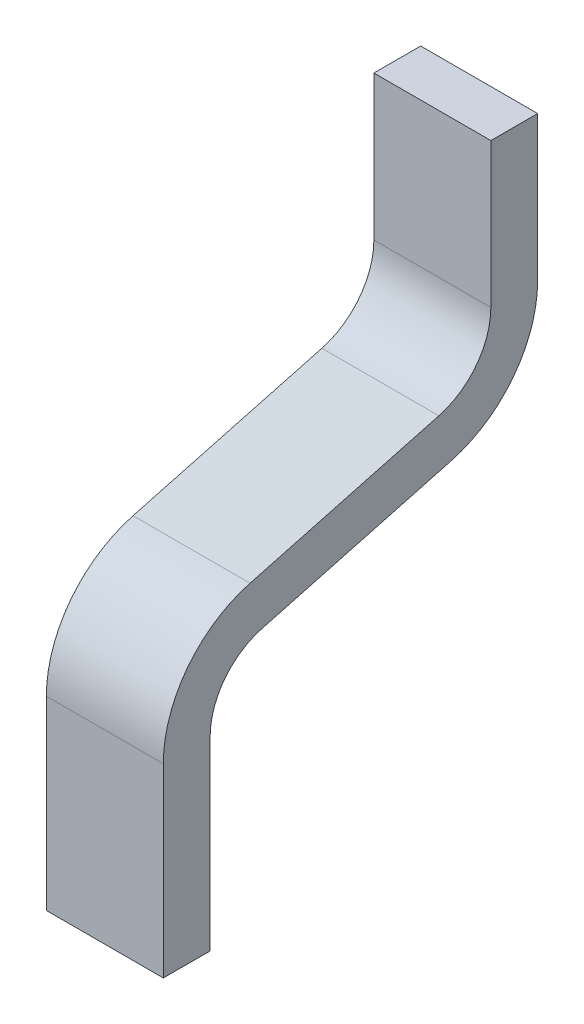
ISO-10303-21;
HEADER;
FILE_DESCRIPTION(('STEP AP214'),'2;1');
FILE_NAME('part.step','',(''),(''),'','','');
FILE_SCHEMA(('AUTOMOTIVE_DESIGN { 1 0 10303 214 1 1 1 1 }'));
ENDSEC;
DATA;
#1=APPLICATION_CONTEXT('core data for automotive mechanical design processes');
#2=APPLICATION_PROTOCOL_DEFINITION('international standard','automotive_design',2000,#1);
#3=PRODUCT_CONTEXT('',#1,'mechanical');
#4=PRODUCT('Part','Part','',(#3));
#5=PRODUCT_RELATED_PRODUCT_CATEGORY('part','',(#4));
#6=PRODUCT_DEFINITION_FORMATION('','',#4);
#7=PRODUCT_DEFINITION_CONTEXT('part definition',#1,'design');
#8=PRODUCT_DEFINITION('design','',#6,#7);
#9=PRODUCT_DEFINITION_SHAPE('','',#8);
#10=(LENGTH_UNIT() NAMED_UNIT(*) SI_UNIT(.MILLI.,.METRE.));
#11=(NAMED_UNIT(*) PLANE_ANGLE_UNIT() SI_UNIT($,.RADIAN.));
#12=(NAMED_UNIT(*) SI_UNIT($,.STERADIAN.) SOLID_ANGLE_UNIT());
#13=UNCERTAINTY_MEASURE_WITH_UNIT(LENGTH_MEASURE(1.E-05),#10,'distance_accuracy_value','');
#14=(GEOMETRIC_REPRESENTATION_CONTEXT(3) GLOBAL_UNCERTAINTY_ASSIGNED_CONTEXT((#13)) GLOBAL_UNIT_ASSIGNED_CONTEXT((#10,
#11,#12)) REPRESENTATION_CONTEXT('',''));
#15=CARTESIAN_POINT('',(0.,0.,0.));
#16=DIRECTION('',(0.,0.,1.));
#17=DIRECTION('',(1.,0.,0.));
#18=AXIS2_PLACEMENT_3D('',#15,#16,#17);
#19=CARTESIAN_POINT('',(-0.125,0.396534602404,-0.05));
#20=DIRECTION('',(0.,0.,1.));
#21=DIRECTION('',(1.,0.,0.));
#22=AXIS2_PLACEMENT_3D('',#19,#20,#21);
#23=PLANE('',#22);
#24=DIRECTION('',(0.,1.,0.));
#25=VECTOR('',#24,1.);
#26=CARTESIAN_POINT('',(-0.125,0.396534602404,-0.05));
#27=LINE('',#26,#25);
#28=CARTESIAN_POINT('',(-0.125,0.,-0.05));
#29=VERTEX_POINT('',#28);
#30=CARTESIAN_POINT('',(-0.125,0.396534602404,-0.05));
#31=VERTEX_POINT('',#30);
#32=EDGE_CURVE('E187',#29,#31,#27,.T.);
#33=ORIENTED_EDGE('',*,*,#32,.T.);
#34=DIRECTION('',(-1.,0.,0.));
#35=VECTOR('',#34,1.);
#36=CARTESIAN_POINT('',(0.,0.396534602404,-0.05));
#37=LINE('',#36,#35);
#38=CARTESIAN_POINT('',(0.125,0.396534602404,-0.05));
#39=VERTEX_POINT('',#38);
#40=EDGE_CURVE('E81',#31,#39,#37,.F.);
#41=ORIENTED_EDGE('',*,*,#40,.T.);
#42=DIRECTION('',(0.,1.,0.));
#43=VECTOR('',#42,1.);
#44=CARTESIAN_POINT('',(0.125,0.396534602404,-0.05));
#45=LINE('',#44,#43);
#46=CARTESIAN_POINT('',(0.125,0.,-0.05));
#47=VERTEX_POINT('',#46);
#48=EDGE_CURVE('E206',#39,#47,#45,.F.);
#49=ORIENTED_EDGE('',*,*,#48,.T.);
#50=DIRECTION('',(1.,0.,0.));
#51=VECTOR('',#50,1.);
#52=CARTESIAN_POINT('',(0.,0.,-0.05));
#53=LINE('',#52,#51);
#54=EDGE_CURVE('E208',#47,#29,#53,.F.);
#55=ORIENTED_EDGE('',*,*,#54,.T.);
#56=EDGE_LOOP('',(#33,#41,#49,#55));
#57=FACE_BOUND('',#56,.T.);
#58=ADVANCED_FACE('F17',(#57),#23,.F.);
#59=CARTESIAN_POINT('',(-0.125,0.891029832298,-0.75));
#60=DIRECTION('',(0.,0.,-1.));
#61=DIRECTION('',(-1.,0.,0.));
#62=AXIS2_PLACEMENT_3D('',#59,#60,#61);
#63=PLANE('',#62);
#64=DIRECTION('',(1.,0.,0.));
#65=VECTOR('',#64,1.);
#66=CARTESIAN_POINT('',(0.,1.2,-0.75));
#67=LINE('',#66,#65);
#68=CARTESIAN_POINT('',(0.125,1.2,-0.75));
#69=VERTEX_POINT('',#68);
#70=CARTESIAN_POINT('',(-0.125,1.2,-0.75));
#71=VERTEX_POINT('',#70);
#72=EDGE_CURVE('E194',#69,#71,#67,.F.);
#73=ORIENTED_EDGE('',*,*,#72,.F.);
#74=DIRECTION('',(0.,1.,0.));
#75=VECTOR('',#74,1.);
#76=CARTESIAN_POINT('',(0.125,0.891029832298,-0.75));
#77=LINE('',#76,#75);
#78=CARTESIAN_POINT('',(0.125,0.891029832298,-0.75));
#79=VERTEX_POINT('',#78);
#80=EDGE_CURVE('E192',#79,#69,#77,.T.);
#81=ORIENTED_EDGE('',*,*,#80,.F.);
#82=DIRECTION('',(1.,0.,0.));
#83=VECTOR('',#82,1.);
#84=CARTESIAN_POINT('',(0.,0.891029832298,-0.75));
#85=LINE('',#84,#83);
#86=CARTESIAN_POINT('',(-0.125,0.891029832298,-0.75));
#87=VERTEX_POINT('',#86);
#88=EDGE_CURVE('E171',#87,#79,#85,.T.);
#89=ORIENTED_EDGE('',*,*,#88,.F.);
#90=DIRECTION('',(0.,1.,0.));
#91=VECTOR('',#90,1.);
#92=CARTESIAN_POINT('',(-0.125,0.891029832298,-0.75));
#93=LINE('',#92,#91);
#94=EDGE_CURVE('E180',#71,#87,#93,.F.);
#95=ORIENTED_EDGE('',*,*,#94,.F.);
#96=EDGE_LOOP('',(#73,#81,#89,#95));
#97=FACE_BOUND('',#96,.T.);
#98=ADVANCED_FACE('F360',(#97),#63,.T.);
#99=CARTESIAN_POINT('',(0.,0.,0.));
#100=DIRECTION('',(0.,1.,0.));
#101=DIRECTION('',(0.,0.,1.));
#102=AXIS2_PLACEMENT_3D('',#99,#100,#101);
#103=PLANE('',#102);
#104=DIRECTION('',(-1.,0.,0.));
#105=VECTOR('',#104,1.);
#106=CARTESIAN_POINT('',(-0.125,0.,0.05));
#107=LINE('',#106,#105);
#108=CARTESIAN_POINT('',(0.125,0.,0.05));
#109=VERTEX_POINT('',#108);
#110=CARTESIAN_POINT('',(-0.125,0.,0.05));
#111=VERTEX_POINT('',#110);
#112=EDGE_CURVE('E175',#109,#111,#107,.T.);
#113=ORIENTED_EDGE('',*,*,#112,.T.);
#114=DIRECTION('',(0.,0.,-1.));
#115=VECTOR('',#114,1.);
#116=CARTESIAN_POINT('',(-0.125,0.,-0.05));
#117=LINE('',#116,#115);
#118=EDGE_CURVE('E189',#111,#29,#117,.T.);
#119=ORIENTED_EDGE('',*,*,#118,.T.);
#120=ORIENTED_EDGE('',*,*,#54,.F.);
#121=DIRECTION('',(0.,0.,1.));
#122=VECTOR('',#121,1.);
#123=CARTESIAN_POINT('',(0.125,0.,-0.05));
#124=LINE('',#123,#122);
#125=EDGE_CURVE('E92',#47,#109,#124,.T.);
#126=ORIENTED_EDGE('',*,*,#125,.T.);
#127=EDGE_LOOP('',(#113,#119,#120,#126));
#128=FACE_BOUND('',#127,.T.);
#129=ADVANCED_FACE('F225',(#128),#103,.F.);
#130=CARTESIAN_POINT('',(0.,1.2,-0.7));
#131=DIRECTION('',(0.,1.,0.));
#132=DIRECTION('',(0.,0.,1.));
#133=AXIS2_PLACEMENT_3D('',#130,#131,#132);
#134=PLANE('',#133);
#135=DIRECTION('',(0.,0.,1.));
#136=VECTOR('',#135,1.);
#137=CARTESIAN_POINT('',(-0.125,1.2,-0.75));
#138=LINE('',#137,#136);
#139=CARTESIAN_POINT('',(-0.125,1.2,-0.65));
#140=VERTEX_POINT('',#139);
#141=EDGE_CURVE('E183',#140,#71,#138,.F.);
#142=ORIENTED_EDGE('',*,*,#141,.F.);
#143=DIRECTION('',(1.,0.,0.));
#144=VECTOR('',#143,1.);
#145=CARTESIAN_POINT('',(-0.125,1.2,-0.65));
#146=LINE('',#145,#144);
#147=CARTESIAN_POINT('',(0.125,1.2,-0.65));
#148=VERTEX_POINT('',#147);
#149=EDGE_CURVE('E121',#148,#140,#146,.F.);
#150=ORIENTED_EDGE('',*,*,#149,.F.);
#151=DIRECTION('',(0.,0.,-1.));
#152=VECTOR('',#151,1.);
#153=CARTESIAN_POINT('',(0.125,1.2,-0.75));
#154=LINE('',#153,#152);
#155=EDGE_CURVE('E117',#69,#148,#154,.F.);
#156=ORIENTED_EDGE('',*,*,#155,.F.);
#157=ORIENTED_EDGE('',*,*,#72,.T.);
#158=EDGE_LOOP('',(#142,#150,#156,#157));
#159=FACE_BOUND('',#158,.T.);
#160=ADVANCED_FACE('F344',(#159),#134,.T.);
#161=CARTESIAN_POINT('',(0.,0.396534602404,-0.2));
#162=DIRECTION('',(-1.,0.,0.));
#163=DIRECTION('',(0.,0.,1.));
#164=AXIS2_PLACEMENT_3D('',#161,#162,#163);
#165=CYLINDRICAL_SURFACE('',#164,0.15);
#166=CARTESIAN_POINT('',(-0.125,0.396534602404,-0.2));
#167=DIRECTION('',(-1.,0.,0.));
#168=DIRECTION('',(0.,0.,1.));
#169=AXIS2_PLACEMENT_3D('',#166,#167,#168);
#170=CIRCLE('',#169,0.15);
#171=CARTESIAN_POINT('',(-0.125,0.541423476347713,-0.161177143234935));
#172=VERTEX_POINT('',#171);
#173=EDGE_CURVE('E153',#172,#31,#170,.F.);
#174=ORIENTED_EDGE('',*,*,#173,.F.);
#175=DIRECTION('',(1.,0.,0.));
#176=VECTOR('',#175,1.);
#177=CARTESIAN_POINT('',(-0.125,0.541423476348,-0.161177143235));
#178=LINE('',#177,#176);
#179=CARTESIAN_POINT('',(0.125,0.541423476347713,-0.161177143234935));
#180=VERTEX_POINT('',#179);
#181=EDGE_CURVE('E152',#180,#172,#178,.F.);
#182=ORIENTED_EDGE('',*,*,#181,.F.);
#183=CARTESIAN_POINT('',(0.125,0.396534602404,-0.2));
#184=DIRECTION('',(-1.,0.,0.));
#185=DIRECTION('',(0.,0.,1.));
#186=AXIS2_PLACEMENT_3D('',#183,#184,#185);
#187=CIRCLE('',#186,0.15);
#188=EDGE_CURVE('E20',#39,#180,#187,.T.);
#189=ORIENTED_EDGE('',*,*,#188,.F.);
#190=ORIENTED_EDGE('',*,*,#40,.F.);
#191=EDGE_LOOP('',(#174,#182,#189,#190));
#192=FACE_BOUND('',#191,.T.);
#193=ADVANCED_FACE('F234',(#192),#165,.F.);
#194=CARTESIAN_POINT('',(0.,0.891029832298,-0.5));
#195=DIRECTION('',(1.,0.,0.));
#196=DIRECTION('',(0.,0.,-1.));
#197=AXIS2_PLACEMENT_3D('',#194,#195,#196);
#198=CYLINDRICAL_SURFACE('',#197,0.25);
#199=ORIENTED_EDGE('',*,*,#88,.T.);
#200=CARTESIAN_POINT('',(0.125,0.891029832298,-0.5));
#201=DIRECTION('',(1.,0.,0.));
#202=DIRECTION('',(0.,0.,-1.));
#203=AXIS2_PLACEMENT_3D('',#200,#201,#202);
#204=CIRCLE('',#203,0.25);
#205=CARTESIAN_POINT('',(0.125,0.649548375725365,-0.564704761275594));
#206=VERTEX_POINT('',#205);
#207=EDGE_CURVE('E155',#206,#79,#204,.T.);
#208=ORIENTED_EDGE('',*,*,#207,.F.);
#209=DIRECTION('',(1.,0.,0.));
#210=VECTOR('',#209,1.);
#211=CARTESIAN_POINT('',(-0.125,0.649548375725885,-0.564704761275763));
#212=LINE('',#211,#210);
#213=CARTESIAN_POINT('',(-0.125,0.649548375725365,-0.564704761275594));
#214=VERTEX_POINT('',#213);
#215=EDGE_CURVE('E167',#214,#206,#212,.T.);
#216=ORIENTED_EDGE('',*,*,#215,.F.);
#217=CARTESIAN_POINT('',(-0.125,0.891029832298,-0.5));
#218=DIRECTION('',(1.,0.,0.));
#219=DIRECTION('',(0.,0.,-1.));
#220=AXIS2_PLACEMENT_3D('',#217,#218,#219);
#221=CIRCLE('',#220,0.25);
#222=EDGE_CURVE('E149',#87,#214,#221,.F.);
#223=ORIENTED_EDGE('',*,*,#222,.F.);
#224=EDGE_LOOP('',(#199,#208,#216,#223));
#225=FACE_BOUND('',#224,.T.);
#226=ADVANCED_FACE('F258',(#225),#198,.T.);
#227=CARTESIAN_POINT('',(-0.125,0.396534602404,0.05));
#228=DIRECTION('',(0.,0.,-1.));
#229=DIRECTION('',(-1.,0.,0.));
#230=AXIS2_PLACEMENT_3D('',#227,#228,#229);
#231=PLANE('',#230);
#232=DIRECTION('',(0.,1.,0.));
#233=VECTOR('',#232,1.);
#234=CARTESIAN_POINT('',(0.125,0.396534602404,0.05));
#235=LINE('',#234,#233);
#236=CARTESIAN_POINT('',(0.125,0.396534602404,0.05));
#237=VERTEX_POINT('',#236);
#238=EDGE_CURVE('E170',#237,#109,#235,.F.);
#239=ORIENTED_EDGE('',*,*,#238,.F.);
#240=DIRECTION('',(-1.,0.,0.));
#241=VECTOR('',#240,1.);
#242=CARTESIAN_POINT('',(0.,0.396534602404,0.05));
#243=LINE('',#242,#241);
#244=CARTESIAN_POINT('',(-0.125,0.396534602404,0.05));
#245=VERTEX_POINT('',#244);
#246=EDGE_CURVE('E148',#245,#237,#243,.F.);
#247=ORIENTED_EDGE('',*,*,#246,.F.);
#248=DIRECTION('',(0.,1.,0.));
#249=VECTOR('',#248,1.);
#250=CARTESIAN_POINT('',(-0.125,0.396534602404,0.05));
#251=LINE('',#250,#249);
#252=EDGE_CURVE('E168',#111,#245,#251,.T.);
#253=ORIENTED_EDGE('',*,*,#252,.F.);
#254=ORIENTED_EDGE('',*,*,#112,.F.);
#255=EDGE_LOOP('',(#239,#247,#253,#254));
#256=FACE_BOUND('',#255,.T.);
#257=ADVANCED_FACE('F256',(#256),#231,.F.);
#258=CARTESIAN_POINT('',(-0.125,0.891029832298,-0.65));
#259=DIRECTION('',(0.,0.,1.));
#260=DIRECTION('',(1.,0.,0.));
#261=AXIS2_PLACEMENT_3D('',#258,#259,#260);
#262=PLANE('',#261);
#263=ORIENTED_EDGE('',*,*,#149,.T.);
#264=DIRECTION('',(0.,1.,0.));
#265=VECTOR('',#264,1.);
#266=CARTESIAN_POINT('',(-0.125,0.891029832298,-0.65));
#267=LINE('',#266,#265);
#268=CARTESIAN_POINT('',(-0.125,0.891029832298,-0.65));
#269=VERTEX_POINT('',#268);
#270=EDGE_CURVE('E127',#140,#269,#267,.F.);
#271=ORIENTED_EDGE('',*,*,#270,.T.);
#272=DIRECTION('',(1.,0.,0.));
#273=VECTOR('',#272,1.);
#274=CARTESIAN_POINT('',(0.,0.891029832298,-0.65));
#275=LINE('',#274,#273);
#276=CARTESIAN_POINT('',(0.125,0.891029832298,-0.65));
#277=VERTEX_POINT('',#276);
#278=EDGE_CURVE('E124',#269,#277,#275,.T.);
#279=ORIENTED_EDGE('',*,*,#278,.T.);
#280=DIRECTION('',(0.,1.,0.));
#281=VECTOR('',#280,1.);
#282=CARTESIAN_POINT('',(0.125,0.891029832298,-0.65));
#283=LINE('',#282,#281);
#284=EDGE_CURVE('E108',#277,#148,#283,.T.);
#285=ORIENTED_EDGE('',*,*,#284,.T.);
#286=EDGE_LOOP('',(#263,#271,#279,#285));
#287=FACE_BOUND('',#286,.T.);
#288=ADVANCED_FACE('F125',(#287),#262,.T.);
#289=CARTESIAN_POINT('',(-0.125,0.541423476348,-0.161177143235));
#290=DIRECTION('',(0.,-0.965925826288944,-0.258819045102985));
#291=DIRECTION('',(0.,0.258819045102985,-0.965925826288944));
#292=AXIS2_PLACEMENT_3D('',#289,#290,#291);
#293=PLANE('',#292);
#294=ORIENTED_EDGE('',*,*,#215,.T.);
#295=DIRECTION('',(0.,0.258819045100867,-0.965925826289511));
#296=VECTOR('',#295,1.);
#297=CARTESIAN_POINT('',(0.125,0.541423476348,-0.161177143235));
#298=LINE('',#297,#296);
#299=EDGE_CURVE('E142',#180,#206,#298,.T.);
#300=ORIENTED_EDGE('',*,*,#299,.F.);
#301=ORIENTED_EDGE('',*,*,#181,.T.);
#302=DIRECTION('',(0.,-0.258819045100867,0.965925826289511));
#303=VECTOR('',#302,1.);
#304=CARTESIAN_POINT('',(-0.125,0.649548375725,-0.564704761276));
#305=LINE('',#304,#303);
#306=EDGE_CURVE('E132',#214,#172,#305,.T.);
#307=ORIENTED_EDGE('',*,*,#306,.F.);
#308=EDGE_LOOP('',(#294,#300,#301,#307));
#309=FACE_BOUND('',#308,.T.);
#310=ADVANCED_FACE('F240',(#309),#293,.T.);
#311=CARTESIAN_POINT('',(0.,0.396534602404,-0.2));
#312=DIRECTION('',(-1.,0.,0.));
#313=DIRECTION('',(0.,0.,1.));
#314=AXIS2_PLACEMENT_3D('',#311,#312,#313);
#315=CYLINDRICAL_SURFACE('',#314,0.25);
#316=DIRECTION('',(1.,0.,0.));
#317=VECTOR('',#316,1.);
#318=CARTESIAN_POINT('',(-0.125,0.638016058976,-0.135295238724));
#319=LINE('',#318,#317);
#320=CARTESIAN_POINT('',(-0.125,0.638016058976118,-0.135295238724127));
#321=VERTEX_POINT('',#320);
#322=CARTESIAN_POINT('',(0.125,0.638016058976118,-0.135295238724127));
#323=VERTEX_POINT('',#322);
#324=EDGE_CURVE('E135',#321,#323,#319,.T.);
#325=ORIENTED_EDGE('',*,*,#324,.F.);
#326=CARTESIAN_POINT('',(-0.125,0.396534602404,-0.2));
#327=DIRECTION('',(-1.,0.,0.));
#328=DIRECTION('',(0.,0.,1.));
#329=AXIS2_PLACEMENT_3D('',#326,#327,#328);
#330=CIRCLE('',#329,0.25);
#331=EDGE_CURVE('E143',#321,#245,#330,.F.);
#332=ORIENTED_EDGE('',*,*,#331,.T.);
#333=ORIENTED_EDGE('',*,*,#246,.T.);
#334=CARTESIAN_POINT('',(0.125,0.396534602404,-0.2));
#335=DIRECTION('',(-1.,0.,0.));
#336=DIRECTION('',(0.,0.,1.));
#337=AXIS2_PLACEMENT_3D('',#334,#335,#336);
#338=CIRCLE('',#337,0.25);
#339=EDGE_CURVE('E146',#237,#323,#338,.T.);
#340=ORIENTED_EDGE('',*,*,#339,.T.);
#341=EDGE_LOOP('',(#325,#332,#333,#340));
#342=FACE_BOUND('',#341,.T.);
#343=ADVANCED_FACE('F253',(#342),#315,.T.);
#344=CARTESIAN_POINT('',(0.125,0.541423476348,-0.161177143235));
#345=DIRECTION('',(1.,0.,0.));
#346=DIRECTION('',(0.,1.,0.));
#347=AXIS2_PLACEMENT_3D('',#344,#345,#346);
#348=PLANE('',#347);
#349=ORIENTED_EDGE('',*,*,#299,.T.);
#350=ORIENTED_EDGE('',*,*,#207,.T.);
#351=ORIENTED_EDGE('',*,*,#80,.T.);
#352=ORIENTED_EDGE('',*,*,#155,.T.);
#353=ORIENTED_EDGE('',*,*,#284,.F.);
#354=CARTESIAN_POINT('',(0.125,0.891029832298,-0.5));
#355=DIRECTION('',(1.,0.,0.));
#356=DIRECTION('',(0.,0.,-1.));
#357=AXIS2_PLACEMENT_3D('',#354,#355,#356);
#358=CIRCLE('',#357,0.15);
#359=CARTESIAN_POINT('',(0.125,0.746140958354305,-0.53882285676523));
#360=VERTEX_POINT('',#359);
#361=EDGE_CURVE('E114',#277,#360,#358,.F.);
#362=ORIENTED_EDGE('',*,*,#361,.T.);
#363=DIRECTION('',(0.,-0.258819045102985,0.965925826288944));
#364=VECTOR('',#363,1.);
#365=CARTESIAN_POINT('',(0.125,0.638016058976,-0.135295238724));
#366=LINE('',#365,#364);
#367=EDGE_CURVE('E245',#323,#360,#366,.F.);
#368=ORIENTED_EDGE('',*,*,#367,.F.);
#369=ORIENTED_EDGE('',*,*,#339,.F.);
#370=ORIENTED_EDGE('',*,*,#238,.T.);
#371=ORIENTED_EDGE('',*,*,#125,.F.);
#372=ORIENTED_EDGE('',*,*,#48,.F.);
#373=ORIENTED_EDGE('',*,*,#188,.T.);
#374=EDGE_LOOP('',(#349,#350,#351,#352,#353,#362,#368,#369,#370,#371,#372,#373));
#375=FACE_BOUND('',#374,.T.);
#376=ADVANCED_FACE('F111',(#375),#348,.T.);
#377=CARTESIAN_POINT('',(0.,0.891029832298,-0.5));
#378=DIRECTION('',(1.,0.,0.));
#379=DIRECTION('',(0.,0.,-1.));
#380=AXIS2_PLACEMENT_3D('',#377,#378,#379);
#381=CYLINDRICAL_SURFACE('',#380,0.15);
#382=ORIENTED_EDGE('',*,*,#361,.F.);
#383=ORIENTED_EDGE('',*,*,#278,.F.);
#384=CARTESIAN_POINT('',(-0.125,0.891029832298,-0.5));
#385=DIRECTION('',(1.,0.,0.));
#386=DIRECTION('',(0.,0.,-1.));
#387=AXIS2_PLACEMENT_3D('',#384,#385,#386);
#388=CIRCLE('',#387,0.15);
#389=CARTESIAN_POINT('',(-0.125,0.746140958354305,-0.53882285676523));
#390=VERTEX_POINT('',#389);
#391=EDGE_CURVE('E35',#390,#269,#388,.T.);
#392=ORIENTED_EDGE('',*,*,#391,.F.);
#393=DIRECTION('',(1.,0.,0.));
#394=VECTOR('',#393,1.);
#395=CARTESIAN_POINT('',(-0.125,0.746140958353952,-0.538822856765013));
#396=LINE('',#395,#394);
#397=EDGE_CURVE('E26',#360,#390,#396,.F.);
#398=ORIENTED_EDGE('',*,*,#397,.F.);
#399=EDGE_LOOP('',(#382,#383,#392,#398));
#400=FACE_BOUND('',#399,.T.);
#401=ADVANCED_FACE('F129',(#400),#381,.F.);
#402=CARTESIAN_POINT('',(-0.125,0.541423476348,-0.161177143235));
#403=DIRECTION('',(-1.,0.,0.));
#404=DIRECTION('',(0.,0.,1.));
#405=AXIS2_PLACEMENT_3D('',#402,#403,#404);
#406=PLANE('',#405);
#407=DIRECTION('',(0.,-0.258819045102985,0.965925826288944));
#408=VECTOR('',#407,1.);
#409=CARTESIAN_POINT('',(-0.125,0.638016058976,-0.135295238724));
#410=LINE('',#409,#408);
#411=EDGE_CURVE('E11',#390,#321,#410,.T.);
#412=ORIENTED_EDGE('',*,*,#411,.F.);
#413=ORIENTED_EDGE('',*,*,#391,.T.);
#414=ORIENTED_EDGE('',*,*,#270,.F.);
#415=ORIENTED_EDGE('',*,*,#141,.T.);
#416=ORIENTED_EDGE('',*,*,#94,.T.);
#417=ORIENTED_EDGE('',*,*,#222,.T.);
#418=ORIENTED_EDGE('',*,*,#306,.T.);
#419=ORIENTED_EDGE('',*,*,#173,.T.);
#420=ORIENTED_EDGE('',*,*,#32,.F.);
#421=ORIENTED_EDGE('',*,*,#118,.F.);
#422=ORIENTED_EDGE('',*,*,#252,.T.);
#423=ORIENTED_EDGE('',*,*,#331,.F.);
#424=EDGE_LOOP('',(#412,#413,#414,#415,#416,#417,#418,#419,#420,#421,#422,#423));
#425=FACE_BOUND('',#424,.T.);
#426=ADVANCED_FACE('F229',(#425),#406,.T.);
#427=CARTESIAN_POINT('',(-0.125,0.638016058976,-0.135295238724));
#428=DIRECTION('',(0.,0.965925826288944,0.258819045102985));
#429=DIRECTION('',(0.,-0.258819045102985,0.965925826288944));
#430=AXIS2_PLACEMENT_3D('',#427,#428,#429);
#431=PLANE('',#430);
#432=ORIENTED_EDGE('',*,*,#397,.T.);
#433=ORIENTED_EDGE('',*,*,#411,.T.);
#434=ORIENTED_EDGE('',*,*,#324,.T.);
#435=ORIENTED_EDGE('',*,*,#367,.T.);
#436=EDGE_LOOP('',(#432,#433,#434,#435));
#437=FACE_BOUND('',#436,.T.);
#438=ADVANCED_FACE('F249',(#437),#431,.T.);
#439=CLOSED_SHELL('',(#58,#98,#129,#160,#193,#226,#257,#288,#310,#343,#376,#401,#426,#438));
#440=MANIFOLD_SOLID_BREP('B1',#439);
#441=ADVANCED_BREP_SHAPE_REPRESENTATION('',(#18,#440),#14);
#442=SHAPE_DEFINITION_REPRESENTATION(#9,#441);
ENDSEC;
END-ISO-10303-21;
